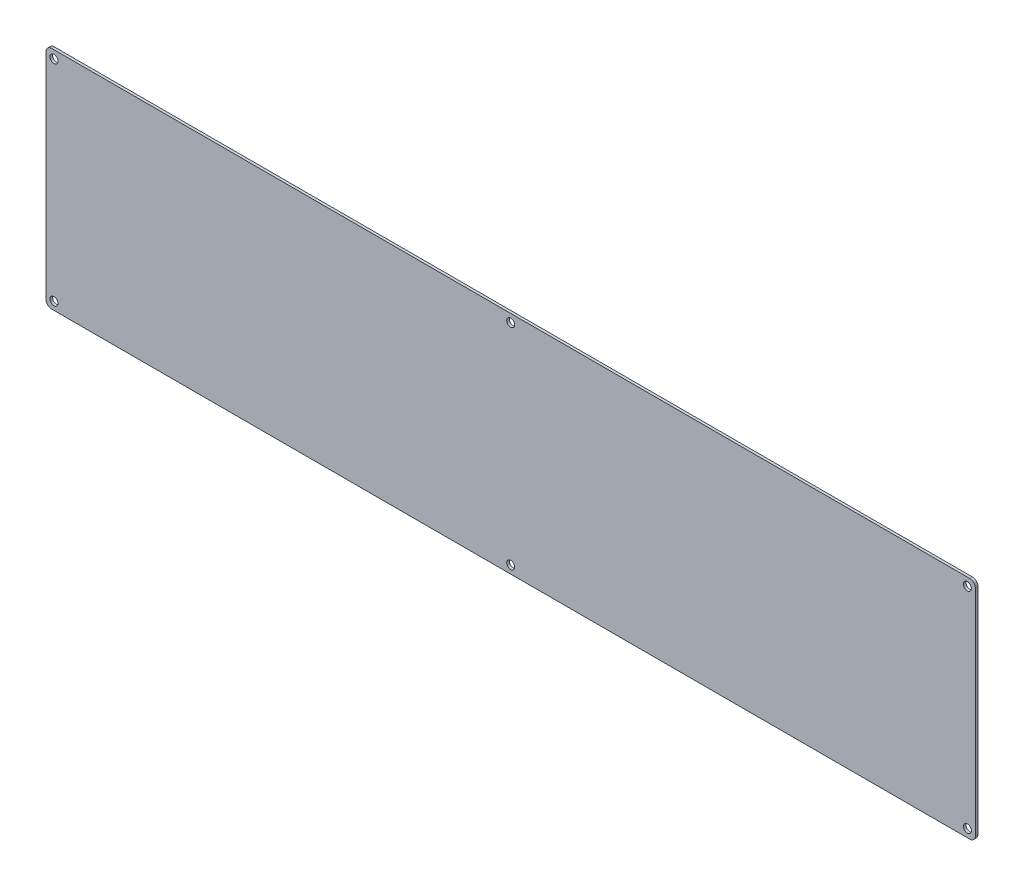
ISO-10303-21;
HEADER;
FILE_DESCRIPTION(('STEP AP214'),'2;1');
FILE_NAME('part.step','',(''),(''),'','','');
FILE_SCHEMA(('AUTOMOTIVE_DESIGN { 1 0 10303 214 1 1 1 1 }'));
ENDSEC;
DATA;
#1=APPLICATION_CONTEXT('core data for automotive mechanical design processes');
#2=APPLICATION_PROTOCOL_DEFINITION('international standard','automotive_design',2000,#1);
#3=PRODUCT_CONTEXT('',#1,'mechanical');
#4=PRODUCT('Part','Part','',(#3));
#5=PRODUCT_RELATED_PRODUCT_CATEGORY('part','',(#4));
#6=PRODUCT_DEFINITION_FORMATION('','',#4);
#7=PRODUCT_DEFINITION_CONTEXT('part definition',#1,'design');
#8=PRODUCT_DEFINITION('design','',#6,#7);
#9=PRODUCT_DEFINITION_SHAPE('','',#8);
#10=(LENGTH_UNIT() NAMED_UNIT(*) SI_UNIT(.MILLI.,.METRE.));
#11=(NAMED_UNIT(*) PLANE_ANGLE_UNIT() SI_UNIT($,.RADIAN.));
#12=(NAMED_UNIT(*) SI_UNIT($,.STERADIAN.) SOLID_ANGLE_UNIT());
#13=UNCERTAINTY_MEASURE_WITH_UNIT(LENGTH_MEASURE(1.E-05),#10,'distance_accuracy_value','');
#14=(GEOMETRIC_REPRESENTATION_CONTEXT(3) GLOBAL_UNCERTAINTY_ASSIGNED_CONTEXT((#13)) GLOBAL_UNIT_ASSIGNED_CONTEXT((#10,
#11,#12)) REPRESENTATION_CONTEXT('',''));
#15=CARTESIAN_POINT('',(0.,0.,0.));
#16=DIRECTION('',(0.,0.,1.));
#17=DIRECTION('',(1.,0.,0.));
#18=AXIS2_PLACEMENT_3D('',#15,#16,#17);
#19=CARTESIAN_POINT('',(5.,193.,2.3));
#20=DIRECTION('',(0.,0.,-1.));
#21=DIRECTION('',(-1.,0.,0.));
#22=AXIS2_PLACEMENT_3D('',#19,#20,#21);
#23=CYLINDRICAL_SURFACE('',#22,5.);
#24=CARTESIAN_POINT('',(5.,193.,0.));
#25=DIRECTION('',(0.,0.,1.));
#26=DIRECTION('',(-1.,0.,0.));
#27=AXIS2_PLACEMENT_3D('',#24,#25,#26);
#28=CIRCLE('',#27,5.);
#29=CARTESIAN_POINT('',(5.00000000000004,198.,0.));
#30=VERTEX_POINT('',#29);
#31=CARTESIAN_POINT('',(0.,193.,0.));
#32=VERTEX_POINT('',#31);
#33=EDGE_CURVE('E137',#30,#32,#28,.T.);
#34=ORIENTED_EDGE('',*,*,#33,.T.);
#35=DIRECTION('',(0.,0.,-1.));
#36=VECTOR('',#35,1.);
#37=CARTESIAN_POINT('',(0.,193.,2.3));
#38=LINE('',#37,#36);
#39=CARTESIAN_POINT('',(0.,193.,2.3));
#40=VERTEX_POINT('',#39);
#41=EDGE_CURVE('E11',#40,#32,#38,.T.);
#42=ORIENTED_EDGE('',*,*,#41,.F.);
#43=CARTESIAN_POINT('',(5.,193.,2.3));
#44=DIRECTION('',(0.,0.,1.));
#45=DIRECTION('',(-1.,0.,0.));
#46=AXIS2_PLACEMENT_3D('',#43,#44,#45);
#47=CIRCLE('',#46,5.);
#48=CARTESIAN_POINT('',(5.00000000000004,198.,2.3));
#49=VERTEX_POINT('',#48);
#50=EDGE_CURVE('E151',#49,#40,#47,.T.);
#51=ORIENTED_EDGE('',*,*,#50,.F.);
#52=DIRECTION('',(0.,0.,-1.));
#53=VECTOR('',#52,1.);
#54=CARTESIAN_POINT('',(5.00000000000004,198.,2.3));
#55=LINE('',#54,#53);
#56=EDGE_CURVE('E133',#49,#30,#55,.T.);
#57=ORIENTED_EDGE('',*,*,#56,.T.);
#58=EDGE_LOOP('',(#34,#42,#51,#57));
#59=FACE_BOUND('',#58,.T.);
#60=ADVANCED_FACE('F39',(#59),#23,.T.);
#61=CARTESIAN_POINT('',(0.,5.00000000000004,2.3));
#62=DIRECTION('',(1.,0.,0.));
#63=DIRECTION('',(0.,0.,-1.));
#64=AXIS2_PLACEMENT_3D('',#61,#62,#63);
#65=PLANE('',#64);
#66=DIRECTION('',(0.,-1.,0.));
#67=VECTOR('',#66,1.);
#68=CARTESIAN_POINT('',(0.,5.00000000000004,0.));
#69=LINE('',#68,#67);
#70=CARTESIAN_POINT('',(0.,5.00000000000004,0.));
#71=VERTEX_POINT('',#70);
#72=EDGE_CURVE('E140',#32,#71,#69,.T.);
#73=ORIENTED_EDGE('',*,*,#72,.T.);
#74=DIRECTION('',(0.,0.,-1.));
#75=VECTOR('',#74,1.);
#76=CARTESIAN_POINT('',(0.,5.00000000000004,2.3));
#77=LINE('',#76,#75);
#78=CARTESIAN_POINT('',(0.,5.00000000000004,2.3));
#79=VERTEX_POINT('',#78);
#80=EDGE_CURVE('E48',#79,#71,#77,.T.);
#81=ORIENTED_EDGE('',*,*,#80,.F.);
#82=DIRECTION('',(0.,-1.,0.));
#83=VECTOR('',#82,1.);
#84=CARTESIAN_POINT('',(0.,5.00000000000004,2.3));
#85=LINE('',#84,#83);
#86=EDGE_CURVE('E100',#40,#79,#85,.T.);
#87=ORIENTED_EDGE('',*,*,#86,.F.);
#88=ORIENTED_EDGE('',*,*,#41,.T.);
#89=EDGE_LOOP('',(#73,#81,#87,#88));
#90=FACE_BOUND('',#89,.T.);
#91=ADVANCED_FACE('F215',(#90),#65,.F.);
#92=CARTESIAN_POINT('',(5.,5.,2.3));
#93=DIRECTION('',(0.,0.,-1.));
#94=DIRECTION('',(-1.,0.,0.));
#95=AXIS2_PLACEMENT_3D('',#92,#93,#94);
#96=CYLINDRICAL_SURFACE('',#95,5.);
#97=CARTESIAN_POINT('',(5.,5.,0.));
#98=DIRECTION('',(0.,0.,1.));
#99=DIRECTION('',(-1.,0.,0.));
#100=AXIS2_PLACEMENT_3D('',#97,#98,#99);
#101=CIRCLE('',#100,5.);
#102=CARTESIAN_POINT('',(5.00000000000004,0.,0.));
#103=VERTEX_POINT('',#102);
#104=EDGE_CURVE('E142',#71,#103,#101,.T.);
#105=ORIENTED_EDGE('',*,*,#104,.T.);
#106=DIRECTION('',(0.,0.,-1.));
#107=VECTOR('',#106,1.);
#108=CARTESIAN_POINT('',(5.00000000000004,0.,2.3));
#109=LINE('',#108,#107);
#110=CARTESIAN_POINT('',(5.00000000000004,0.,2.3));
#111=VERTEX_POINT('',#110);
#112=EDGE_CURVE('E158',#111,#103,#109,.T.);
#113=ORIENTED_EDGE('',*,*,#112,.F.);
#114=CARTESIAN_POINT('',(5.,5.,2.3));
#115=DIRECTION('',(0.,0.,1.));
#116=DIRECTION('',(-1.,0.,0.));
#117=AXIS2_PLACEMENT_3D('',#114,#115,#116);
#118=CIRCLE('',#117,5.);
#119=EDGE_CURVE('E399',#79,#111,#118,.T.);
#120=ORIENTED_EDGE('',*,*,#119,.F.);
#121=ORIENTED_EDGE('',*,*,#80,.T.);
#122=EDGE_LOOP('',(#105,#113,#120,#121));
#123=FACE_BOUND('',#122,.T.);
#124=ADVANCED_FACE('F219',(#123),#96,.T.);
#125=CARTESIAN_POINT('',(5.00000000000004,0.,2.3));
#126=DIRECTION('',(0.,1.,0.));
#127=DIRECTION('',(0.,0.,1.));
#128=AXIS2_PLACEMENT_3D('',#125,#126,#127);
#129=PLANE('',#128);
#130=DIRECTION('',(1.,0.,0.));
#131=VECTOR('',#130,1.);
#132=CARTESIAN_POINT('',(5.00000000000004,0.,0.));
#133=LINE('',#132,#131);
#134=CARTESIAN_POINT('',(810.,0.,0.));
#135=VERTEX_POINT('',#134);
#136=EDGE_CURVE('E144',#103,#135,#133,.T.);
#137=ORIENTED_EDGE('',*,*,#136,.T.);
#138=DIRECTION('',(0.,0.,-1.));
#139=VECTOR('',#138,1.);
#140=CARTESIAN_POINT('',(810.,0.,2.3));
#141=LINE('',#140,#139);
#142=CARTESIAN_POINT('',(810.,0.,2.3));
#143=VERTEX_POINT('',#142);
#144=EDGE_CURVE('E155',#143,#135,#141,.T.);
#145=ORIENTED_EDGE('',*,*,#144,.F.);
#146=DIRECTION('',(1.,0.,0.));
#147=VECTOR('',#146,1.);
#148=CARTESIAN_POINT('',(5.00000000000004,0.,2.3));
#149=LINE('',#148,#147);
#150=EDGE_CURVE('E401',#111,#143,#149,.T.);
#151=ORIENTED_EDGE('',*,*,#150,.F.);
#152=ORIENTED_EDGE('',*,*,#112,.T.);
#153=EDGE_LOOP('',(#137,#145,#151,#152));
#154=FACE_BOUND('',#153,.T.);
#155=ADVANCED_FACE('F223',(#154),#129,.F.);
#156=CARTESIAN_POINT('',(810.,5.,2.3));
#157=DIRECTION('',(0.,0.,-1.));
#158=DIRECTION('',(-1.,0.,0.));
#159=AXIS2_PLACEMENT_3D('',#156,#157,#158);
#160=CYLINDRICAL_SURFACE('',#159,5.);
#161=CARTESIAN_POINT('',(810.,5.,0.));
#162=DIRECTION('',(0.,0.,1.));
#163=DIRECTION('',(1.,0.,0.));
#164=AXIS2_PLACEMENT_3D('',#161,#162,#163);
#165=CIRCLE('',#164,5.);
#166=CARTESIAN_POINT('',(815.,5.,0.));
#167=VERTEX_POINT('',#166);
#168=EDGE_CURVE('E146',#135,#167,#165,.T.);
#169=ORIENTED_EDGE('',*,*,#168,.T.);
#170=DIRECTION('',(0.,0.,-1.));
#171=VECTOR('',#170,1.);
#172=CARTESIAN_POINT('',(815.,5.,2.3));
#173=LINE('',#172,#171);
#174=CARTESIAN_POINT('',(815.,5.,2.3));
#175=VERTEX_POINT('',#174);
#176=EDGE_CURVE('E128',#175,#167,#173,.T.);
#177=ORIENTED_EDGE('',*,*,#176,.F.);
#178=CARTESIAN_POINT('',(810.,5.,2.3));
#179=DIRECTION('',(0.,0.,1.));
#180=DIRECTION('',(1.,0.,0.));
#181=AXIS2_PLACEMENT_3D('',#178,#179,#180);
#182=CIRCLE('',#181,5.);
#183=EDGE_CURVE('E119',#143,#175,#182,.T.);
#184=ORIENTED_EDGE('',*,*,#183,.F.);
#185=ORIENTED_EDGE('',*,*,#144,.T.);
#186=EDGE_LOOP('',(#169,#177,#184,#185));
#187=FACE_BOUND('',#186,.T.);
#188=ADVANCED_FACE('F229',(#187),#160,.T.);
#189=CARTESIAN_POINT('',(815.,5.00000000000004,2.3));
#190=DIRECTION('',(-1.,0.,0.));
#191=DIRECTION('',(0.,0.,1.));
#192=AXIS2_PLACEMENT_3D('',#189,#190,#191);
#193=PLANE('',#192);
#194=DIRECTION('',(0.,1.,0.));
#195=VECTOR('',#194,1.);
#196=CARTESIAN_POINT('',(815.,5.00000000000004,0.));
#197=LINE('',#196,#195);
#198=CARTESIAN_POINT('',(815.,193.,0.));
#199=VERTEX_POINT('',#198);
#200=EDGE_CURVE('E127',#167,#199,#197,.T.);
#201=ORIENTED_EDGE('',*,*,#200,.T.);
#202=DIRECTION('',(0.,0.,-1.));
#203=VECTOR('',#202,1.);
#204=CARTESIAN_POINT('',(815.,193.,2.3));
#205=LINE('',#204,#203);
#206=CARTESIAN_POINT('',(815.,193.,2.3));
#207=VERTEX_POINT('',#206);
#208=EDGE_CURVE('E124',#207,#199,#205,.T.);
#209=ORIENTED_EDGE('',*,*,#208,.F.);
#210=DIRECTION('',(0.,1.,0.));
#211=VECTOR('',#210,1.);
#212=CARTESIAN_POINT('',(815.,5.00000000000004,2.3));
#213=LINE('',#212,#211);
#214=EDGE_CURVE('E113',#175,#207,#213,.T.);
#215=ORIENTED_EDGE('',*,*,#214,.F.);
#216=ORIENTED_EDGE('',*,*,#176,.T.);
#217=EDGE_LOOP('',(#201,#209,#215,#216));
#218=FACE_BOUND('',#217,.T.);
#219=ADVANCED_FACE('F125',(#218),#193,.F.);
#220=CARTESIAN_POINT('',(810.,193.,2.3));
#221=DIRECTION('',(0.,0.,-1.));
#222=DIRECTION('',(-1.,0.,0.));
#223=AXIS2_PLACEMENT_3D('',#220,#221,#222);
#224=CYLINDRICAL_SURFACE('',#223,5.);
#225=CARTESIAN_POINT('',(810.,193.,0.));
#226=DIRECTION('',(0.,0.,1.));
#227=DIRECTION('',(-1.,0.,0.));
#228=AXIS2_PLACEMENT_3D('',#225,#226,#227);
#229=CIRCLE('',#228,5.);
#230=CARTESIAN_POINT('',(810.,198.,0.));
#231=VERTEX_POINT('',#230);
#232=EDGE_CURVE('E86',#199,#231,#229,.T.);
#233=ORIENTED_EDGE('',*,*,#232,.T.);
#234=DIRECTION('',(0.,0.,-1.));
#235=VECTOR('',#234,1.);
#236=CARTESIAN_POINT('',(810.,198.,2.3));
#237=LINE('',#236,#235);
#238=CARTESIAN_POINT('',(810.,198.,2.3));
#239=VERTEX_POINT('',#238);
#240=EDGE_CURVE('E129',#239,#231,#237,.T.);
#241=ORIENTED_EDGE('',*,*,#240,.F.);
#242=CARTESIAN_POINT('',(810.,193.,2.3));
#243=DIRECTION('',(0.,0.,1.));
#244=DIRECTION('',(-1.,0.,0.));
#245=AXIS2_PLACEMENT_3D('',#242,#243,#244);
#246=CIRCLE('',#245,5.);
#247=EDGE_CURVE('E117',#207,#239,#246,.T.);
#248=ORIENTED_EDGE('',*,*,#247,.F.);
#249=ORIENTED_EDGE('',*,*,#208,.T.);
#250=EDGE_LOOP('',(#233,#241,#248,#249));
#251=FACE_BOUND('',#250,.T.);
#252=ADVANCED_FACE('F131',(#251),#224,.T.);
#253=CARTESIAN_POINT('',(5.00000000000004,198.,2.3));
#254=DIRECTION('',(0.,-1.,0.));
#255=DIRECTION('',(0.,0.,-1.));
#256=AXIS2_PLACEMENT_3D('',#253,#254,#255);
#257=PLANE('',#256);
#258=DIRECTION('',(-1.,0.,0.));
#259=VECTOR('',#258,1.);
#260=CARTESIAN_POINT('',(5.00000000000004,198.,0.));
#261=LINE('',#260,#259);
#262=EDGE_CURVE('E92',#231,#30,#261,.T.);
#263=ORIENTED_EDGE('',*,*,#262,.T.);
#264=ORIENTED_EDGE('',*,*,#56,.F.);
#265=DIRECTION('',(-1.,0.,0.));
#266=VECTOR('',#265,1.);
#267=CARTESIAN_POINT('',(5.00000000000004,198.,2.3));
#268=LINE('',#267,#266);
#269=EDGE_CURVE('E57',#239,#49,#268,.T.);
#270=ORIENTED_EDGE('',*,*,#269,.F.);
#271=ORIENTED_EDGE('',*,*,#240,.T.);
#272=EDGE_LOOP('',(#263,#264,#270,#271));
#273=FACE_BOUND('',#272,.T.);
#274=ADVANCED_FACE('F204',(#273),#257,.F.);
#275=CARTESIAN_POINT('',(5.,193.,2.3));
#276=DIRECTION('',(0.,0.,-1.));
#277=DIRECTION('',(-1.,0.,0.));
#278=AXIS2_PLACEMENT_3D('',#275,#276,#277);
#279=PLANE('',#278);
#280=CARTESIAN_POINT('',(808.,7.,2.3));
#281=DIRECTION('',(0.,0.,1.));
#282=DIRECTION('',(1.,0.,0.));
#283=AXIS2_PLACEMENT_3D('',#280,#281,#282);
#284=CIRCLE('',#283,3.49999999999995);
#285=CARTESIAN_POINT('',(811.5,7.,2.3));
#286=VERTEX_POINT('',#285);
#287=EDGE_CURVE('E383',#286,#286,#284,.T.);
#288=ORIENTED_EDGE('',*,*,#287,.F.);
#289=EDGE_LOOP('',(#288));
#290=FACE_BOUND('',#289,.T.);
#291=CARTESIAN_POINT('',(407.5,191.,2.3));
#292=DIRECTION('',(0.,0.,1.));
#293=DIRECTION('',(1.,0.,0.));
#294=AXIS2_PLACEMENT_3D('',#291,#292,#293);
#295=CIRCLE('',#294,3.5);
#296=CARTESIAN_POINT('',(411.,191.,2.3));
#297=VERTEX_POINT('',#296);
#298=EDGE_CURVE('E380',#297,#297,#295,.T.);
#299=ORIENTED_EDGE('',*,*,#298,.F.);
#300=EDGE_LOOP('',(#299));
#301=FACE_BOUND('',#300,.T.);
#302=CARTESIAN_POINT('',(407.5,7.,2.3));
#303=DIRECTION('',(0.,0.,1.));
#304=DIRECTION('',(1.,0.,0.));
#305=AXIS2_PLACEMENT_3D('',#302,#303,#304);
#306=CIRCLE('',#305,3.5);
#307=CARTESIAN_POINT('',(411.,7.,2.3));
#308=VERTEX_POINT('',#307);
#309=EDGE_CURVE('E382',#308,#308,#306,.T.);
#310=ORIENTED_EDGE('',*,*,#309,.F.);
#311=EDGE_LOOP('',(#310));
#312=FACE_BOUND('',#311,.T.);
#313=CARTESIAN_POINT('',(7.,191.,2.3));
#314=DIRECTION('',(0.,0.,1.));
#315=DIRECTION('',(1.,0.,0.));
#316=AXIS2_PLACEMENT_3D('',#313,#314,#315);
#317=CIRCLE('',#316,3.5);
#318=CARTESIAN_POINT('',(10.5,191.,2.3));
#319=VERTEX_POINT('',#318);
#320=EDGE_CURVE('E386',#319,#319,#317,.T.);
#321=ORIENTED_EDGE('',*,*,#320,.F.);
#322=EDGE_LOOP('',(#321));
#323=FACE_BOUND('',#322,.T.);
#324=CARTESIAN_POINT('',(808.,191.,2.3));
#325=DIRECTION('',(0.,0.,1.));
#326=DIRECTION('',(1.,0.,0.));
#327=AXIS2_PLACEMENT_3D('',#324,#325,#326);
#328=CIRCLE('',#327,3.49999999999995);
#329=CARTESIAN_POINT('',(811.5,191.,2.3));
#330=VERTEX_POINT('',#329);
#331=EDGE_CURVE('E389',#330,#330,#328,.T.);
#332=ORIENTED_EDGE('',*,*,#331,.F.);
#333=EDGE_LOOP('',(#332));
#334=FACE_BOUND('',#333,.T.);
#335=CARTESIAN_POINT('',(7.,7.,2.3));
#336=DIRECTION('',(0.,0.,1.));
#337=DIRECTION('',(1.,0.,0.));
#338=AXIS2_PLACEMENT_3D('',#335,#336,#337);
#339=CIRCLE('',#338,3.5);
#340=CARTESIAN_POINT('',(10.5,7.,2.3));
#341=VERTEX_POINT('',#340);
#342=EDGE_CURVE('E167',#341,#341,#339,.T.);
#343=ORIENTED_EDGE('',*,*,#342,.F.);
#344=EDGE_LOOP('',(#343));
#345=FACE_BOUND('',#344,.T.);
#346=ORIENTED_EDGE('',*,*,#50,.T.);
#347=ORIENTED_EDGE('',*,*,#86,.T.);
#348=ORIENTED_EDGE('',*,*,#119,.T.);
#349=ORIENTED_EDGE('',*,*,#150,.T.);
#350=ORIENTED_EDGE('',*,*,#183,.T.);
#351=ORIENTED_EDGE('',*,*,#214,.T.);
#352=ORIENTED_EDGE('',*,*,#247,.T.);
#353=ORIENTED_EDGE('',*,*,#269,.T.);
#354=EDGE_LOOP('',(#346,#347,#348,#349,#350,#351,#352,#353));
#355=FACE_BOUND('',#354,.T.);
#356=ADVANCED_FACE('F115',(#290,#301,#312,#323,#334,#345,#355),#279,.F.);
#357=CARTESIAN_POINT('',(5.,193.,0.));
#358=DIRECTION('',(0.,0.,-1.));
#359=DIRECTION('',(-1.,0.,0.));
#360=AXIS2_PLACEMENT_3D('',#357,#358,#359);
#361=PLANE('',#360);
#362=CARTESIAN_POINT('',(808.,7.,0.));
#363=DIRECTION('',(0.,0.,-1.));
#364=DIRECTION('',(-1.,0.,0.));
#365=AXIS2_PLACEMENT_3D('',#362,#363,#364);
#366=CIRCLE('',#365,3.49999999999995);
#367=CARTESIAN_POINT('',(811.5,7.,0.));
#368=VERTEX_POINT('',#367);
#369=EDGE_CURVE('E42',#368,#368,#366,.T.);
#370=ORIENTED_EDGE('',*,*,#369,.F.);
#371=EDGE_LOOP('',(#370));
#372=FACE_BOUND('',#371,.T.);
#373=CARTESIAN_POINT('',(407.5,191.,0.));
#374=DIRECTION('',(0.,0.,-1.));
#375=DIRECTION('',(-1.,0.,0.));
#376=AXIS2_PLACEMENT_3D('',#373,#374,#375);
#377=CIRCLE('',#376,3.5);
#378=CARTESIAN_POINT('',(411.,191.,0.));
#379=VERTEX_POINT('',#378);
#380=EDGE_CURVE('E175',#379,#379,#377,.T.);
#381=ORIENTED_EDGE('',*,*,#380,.F.);
#382=EDGE_LOOP('',(#381));
#383=FACE_BOUND('',#382,.T.);
#384=CARTESIAN_POINT('',(407.5,7.,0.));
#385=DIRECTION('',(0.,0.,-1.));
#386=DIRECTION('',(-1.,0.,0.));
#387=AXIS2_PLACEMENT_3D('',#384,#385,#386);
#388=CIRCLE('',#387,3.5);
#389=CARTESIAN_POINT('',(411.,7.,0.));
#390=VERTEX_POINT('',#389);
#391=EDGE_CURVE('E173',#390,#390,#388,.T.);
#392=ORIENTED_EDGE('',*,*,#391,.F.);
#393=EDGE_LOOP('',(#392));
#394=FACE_BOUND('',#393,.T.);
#395=CARTESIAN_POINT('',(7.,191.,0.));
#396=DIRECTION('',(0.,0.,-1.));
#397=DIRECTION('',(-1.,0.,0.));
#398=AXIS2_PLACEMENT_3D('',#395,#396,#397);
#399=CIRCLE('',#398,3.5);
#400=CARTESIAN_POINT('',(10.5,191.,0.));
#401=VERTEX_POINT('',#400);
#402=EDGE_CURVE('E170',#401,#401,#399,.T.);
#403=ORIENTED_EDGE('',*,*,#402,.F.);
#404=EDGE_LOOP('',(#403));
#405=FACE_BOUND('',#404,.T.);
#406=CARTESIAN_POINT('',(808.,191.,0.));
#407=DIRECTION('',(0.,0.,-1.));
#408=DIRECTION('',(-1.,0.,0.));
#409=AXIS2_PLACEMENT_3D('',#406,#407,#408);
#410=CIRCLE('',#409,3.49999999999995);
#411=CARTESIAN_POINT('',(811.5,191.,0.));
#412=VERTEX_POINT('',#411);
#413=EDGE_CURVE('E166',#412,#412,#410,.T.);
#414=ORIENTED_EDGE('',*,*,#413,.F.);
#415=EDGE_LOOP('',(#414));
#416=FACE_BOUND('',#415,.T.);
#417=CARTESIAN_POINT('',(7.,7.,0.));
#418=DIRECTION('',(0.,0.,-1.));
#419=DIRECTION('',(-1.,0.,0.));
#420=AXIS2_PLACEMENT_3D('',#417,#418,#419);
#421=CIRCLE('',#420,3.5);
#422=CARTESIAN_POINT('',(10.5,7.,0.));
#423=VERTEX_POINT('',#422);
#424=EDGE_CURVE('E163',#423,#423,#421,.T.);
#425=ORIENTED_EDGE('',*,*,#424,.F.);
#426=EDGE_LOOP('',(#425));
#427=FACE_BOUND('',#426,.T.);
#428=ORIENTED_EDGE('',*,*,#33,.F.);
#429=ORIENTED_EDGE('',*,*,#262,.F.);
#430=ORIENTED_EDGE('',*,*,#232,.F.);
#431=ORIENTED_EDGE('',*,*,#200,.F.);
#432=ORIENTED_EDGE('',*,*,#168,.F.);
#433=ORIENTED_EDGE('',*,*,#136,.F.);
#434=ORIENTED_EDGE('',*,*,#104,.F.);
#435=ORIENTED_EDGE('',*,*,#72,.F.);
#436=EDGE_LOOP('',(#428,#429,#430,#431,#432,#433,#434,#435));
#437=FACE_BOUND('',#436,.T.);
#438=ADVANCED_FACE('F185',(#372,#383,#394,#405,#416,#427,#437),#361,.T.);
#439=CARTESIAN_POINT('',(7.,7.,-1.2E-05));
#440=DIRECTION('',(0.,0.,1.));
#441=DIRECTION('',(1.,0.,0.));
#442=AXIS2_PLACEMENT_3D('',#439,#440,#441);
#443=CYLINDRICAL_SURFACE('',#442,3.5);
#444=CARTESIAN_POINT('',(10.5,7.,0.));
#445=CARTESIAN_POINT('',(10.5,7.,0.0239583333333333));
#446=CARTESIAN_POINT('',(10.5,7.,0.0479166666666667));
#447=CARTESIAN_POINT('',(10.5,7.,0.0958333333333333));
#448=CARTESIAN_POINT('',(10.5,7.,0.119791666666667));
#449=CARTESIAN_POINT('',(10.5,7.,0.167708333333333));
#450=CARTESIAN_POINT('',(10.5,7.,0.191666666666667));
#451=CARTESIAN_POINT('',(10.5,7.,0.239583333333333));
#452=CARTESIAN_POINT('',(10.5,7.,0.263541666666667));
#453=CARTESIAN_POINT('',(10.5,7.,0.311458333333333));
#454=CARTESIAN_POINT('',(10.5,7.,0.335416666666667));
#455=CARTESIAN_POINT('',(10.5,7.,0.383333333333333));
#456=CARTESIAN_POINT('',(10.5,7.,0.407291666666667));
#457=CARTESIAN_POINT('',(10.5,7.,0.455208333333333));
#458=CARTESIAN_POINT('',(10.5,7.,0.479166666666667));
#459=CARTESIAN_POINT('',(10.5,7.,0.527083333333333));
#460=CARTESIAN_POINT('',(10.5,7.,0.551041666666667));
#461=CARTESIAN_POINT('',(10.5,7.,0.598958333333333));
#462=CARTESIAN_POINT('',(10.5,7.,0.622916666666667));
#463=CARTESIAN_POINT('',(10.5,7.,0.670833333333333));
#464=CARTESIAN_POINT('',(10.5,7.,0.694791666666667));
#465=CARTESIAN_POINT('',(10.5,7.,0.742708333333333));
#466=CARTESIAN_POINT('',(10.5,7.,0.766666666666667));
#467=CARTESIAN_POINT('',(10.5,7.,0.814583333333333));
#468=CARTESIAN_POINT('',(10.5,7.,0.838541666666667));
#469=CARTESIAN_POINT('',(10.5,7.,0.886458333333333));
#470=CARTESIAN_POINT('',(10.5,7.,0.910416666666667));
#471=CARTESIAN_POINT('',(10.5,7.,0.958333333333333));
#472=CARTESIAN_POINT('',(10.5,7.,0.982291666666667));
#473=CARTESIAN_POINT('',(10.5,7.,1.03020833333333));
#474=CARTESIAN_POINT('',(10.5,7.,1.05416666666667));
#475=CARTESIAN_POINT('',(10.5,7.,1.10208333333333));
#476=CARTESIAN_POINT('',(10.5,7.,1.12604166666667));
#477=CARTESIAN_POINT('',(10.5,7.,1.17395833333333));
#478=CARTESIAN_POINT('',(10.5,7.,1.19791666666667));
#479=CARTESIAN_POINT('',(10.5,7.,1.24583333333333));
#480=CARTESIAN_POINT('',(10.5,7.,1.26979166666667));
#481=CARTESIAN_POINT('',(10.5,7.,1.31770833333333));
#482=CARTESIAN_POINT('',(10.5,7.,1.34166666666667));
#483=CARTESIAN_POINT('',(10.5,7.,1.38958333333333));
#484=CARTESIAN_POINT('',(10.5,7.,1.41354166666667));
#485=CARTESIAN_POINT('',(10.5,7.,1.46145833333333));
#486=CARTESIAN_POINT('',(10.5,7.,1.48541666666667));
#487=CARTESIAN_POINT('',(10.5,7.,1.53333333333333));
#488=CARTESIAN_POINT('',(10.5,7.,1.55729166666667));
#489=CARTESIAN_POINT('',(10.5,7.,1.60520833333333));
#490=CARTESIAN_POINT('',(10.5,7.,1.62916666666667));
#491=CARTESIAN_POINT('',(10.5,7.,1.67708333333333));
#492=CARTESIAN_POINT('',(10.5,7.,1.70104166666667));
#493=CARTESIAN_POINT('',(10.5,7.,1.74895833333333));
#494=CARTESIAN_POINT('',(10.5,7.,1.77291666666667));
#495=CARTESIAN_POINT('',(10.5,7.,1.82083333333333));
#496=CARTESIAN_POINT('',(10.5,7.,1.84479166666667));
#497=CARTESIAN_POINT('',(10.5,7.,1.89270833333333));
#498=CARTESIAN_POINT('',(10.5,7.,1.91666666666667));
#499=CARTESIAN_POINT('',(10.5,7.,1.96458333333333));
#500=CARTESIAN_POINT('',(10.5,7.,1.98854166666667));
#501=CARTESIAN_POINT('',(10.5,7.,2.03645833333333));
#502=CARTESIAN_POINT('',(10.5,7.,2.06041666666667));
#503=CARTESIAN_POINT('',(10.5,7.,2.10833333333333));
#504=CARTESIAN_POINT('',(10.5,7.,2.13229166666667));
#505=CARTESIAN_POINT('',(10.5,7.,2.18020833333333));
#506=CARTESIAN_POINT('',(10.5,7.,2.20416666666667));
#507=CARTESIAN_POINT('',(10.5,7.,2.25208333333333));
#508=CARTESIAN_POINT('',(10.5,7.,2.27604166666667));
#509=CARTESIAN_POINT('',(10.5,7.,2.3));
#510=B_SPLINE_CURVE_WITH_KNOTS('',3,(#444,#445,#446,#447,#448,#449,#450,#451,#452,#453,#454,
#455,#456,#457,#458,#459,#460,#461,#462,#463,#464,#465,#466,#467,#468,#469,#470,#471,#472,#473,
#474,#475,#476,#477,#478,#479,#480,#481,#482,#483,#484,#485,#486,#487,#488,#489,#490,#491,#492,
#493,#494,#495,#496,#497,#498,#499,#500,#501,#502,#503,#504,#505,#506,#507,#508,#509),
.UNSPECIFIED.,.F.,.F.,(4,2,2,2,2,2,2,2,2,2,2,2,2,2,2,2,2,2,2,2,2,2,2,2,2,2,2,2,2,2,2,2,4),(0.,
0.071875,0.14375,0.215625,0.2875,0.359375,0.43125,0.503125,0.575,0.646875,0.71875,0.790625,
0.8625,0.934375,1.00625,1.078125,1.15,1.221875,1.29375,1.365625,1.4375,1.509375,1.58125,
1.653125,1.725,1.796875,1.86875,1.940625,2.0125,2.084375,2.15625,2.228125,2.3),.UNSPECIFIED.);
#511=EDGE_CURVE('BSEAM188',#423,#341,#510,.T.);
#512=ORIENTED_EDGE('',*,*,#424,.T.);
#513=ORIENTED_EDGE('',*,*,#342,.T.);
#514=ORIENTED_EDGE('',*,*,#511,.T.);
#515=ORIENTED_EDGE('',*,*,#511,.F.);
#516=EDGE_LOOP('',(#512,#514,#513,#515));
#517=FACE_BOUND('',#516,.T.);
#518=ADVANCED_FACE('F188',(#517),#443,.F.);
#519=CARTESIAN_POINT('',(808.,191.,-1.2E-05));
#520=DIRECTION('',(0.,0.,1.));
#521=DIRECTION('',(1.,0.,0.));
#522=AXIS2_PLACEMENT_3D('',#519,#520,#521);
#523=CYLINDRICAL_SURFACE('',#522,3.49999999999995);
#524=CARTESIAN_POINT('',(811.5,191.,0.));
#525=CARTESIAN_POINT('',(811.5,191.,0.0239583333333333));
#526=CARTESIAN_POINT('',(811.5,191.,0.0479166666666667));
#527=CARTESIAN_POINT('',(811.5,191.,0.0958333333333333));
#528=CARTESIAN_POINT('',(811.5,191.,0.119791666666667));
#529=CARTESIAN_POINT('',(811.5,191.,0.167708333333333));
#530=CARTESIAN_POINT('',(811.5,191.,0.191666666666667));
#531=CARTESIAN_POINT('',(811.5,191.,0.239583333333333));
#532=CARTESIAN_POINT('',(811.5,191.,0.263541666666667));
#533=CARTESIAN_POINT('',(811.5,191.,0.311458333333333));
#534=CARTESIAN_POINT('',(811.5,191.,0.335416666666667));
#535=CARTESIAN_POINT('',(811.5,191.,0.383333333333333));
#536=CARTESIAN_POINT('',(811.5,191.,0.407291666666667));
#537=CARTESIAN_POINT('',(811.5,191.,0.455208333333333));
#538=CARTESIAN_POINT('',(811.5,191.,0.479166666666667));
#539=CARTESIAN_POINT('',(811.5,191.,0.527083333333333));
#540=CARTESIAN_POINT('',(811.5,191.,0.551041666666667));
#541=CARTESIAN_POINT('',(811.5,191.,0.598958333333333));
#542=CARTESIAN_POINT('',(811.5,191.,0.622916666666667));
#543=CARTESIAN_POINT('',(811.5,191.,0.670833333333333));
#544=CARTESIAN_POINT('',(811.5,191.,0.694791666666667));
#545=CARTESIAN_POINT('',(811.5,191.,0.742708333333333));
#546=CARTESIAN_POINT('',(811.5,191.,0.766666666666667));
#547=CARTESIAN_POINT('',(811.5,191.,0.814583333333333));
#548=CARTESIAN_POINT('',(811.5,191.,0.838541666666667));
#549=CARTESIAN_POINT('',(811.5,191.,0.886458333333333));
#550=CARTESIAN_POINT('',(811.5,191.,0.910416666666667));
#551=CARTESIAN_POINT('',(811.5,191.,0.958333333333333));
#552=CARTESIAN_POINT('',(811.5,191.,0.982291666666667));
#553=CARTESIAN_POINT('',(811.5,191.,1.03020833333333));
#554=CARTESIAN_POINT('',(811.5,191.,1.05416666666667));
#555=CARTESIAN_POINT('',(811.5,191.,1.10208333333333));
#556=CARTESIAN_POINT('',(811.5,191.,1.12604166666667));
#557=CARTESIAN_POINT('',(811.5,191.,1.17395833333333));
#558=CARTESIAN_POINT('',(811.5,191.,1.19791666666667));
#559=CARTESIAN_POINT('',(811.5,191.,1.24583333333333));
#560=CARTESIAN_POINT('',(811.5,191.,1.26979166666667));
#561=CARTESIAN_POINT('',(811.5,191.,1.31770833333333));
#562=CARTESIAN_POINT('',(811.5,191.,1.34166666666667));
#563=CARTESIAN_POINT('',(811.5,191.,1.38958333333333));
#564=CARTESIAN_POINT('',(811.5,191.,1.41354166666667));
#565=CARTESIAN_POINT('',(811.5,191.,1.46145833333333));
#566=CARTESIAN_POINT('',(811.5,191.,1.48541666666667));
#567=CARTESIAN_POINT('',(811.5,191.,1.53333333333333));
#568=CARTESIAN_POINT('',(811.5,191.,1.55729166666667));
#569=CARTESIAN_POINT('',(811.5,191.,1.60520833333333));
#570=CARTESIAN_POINT('',(811.5,191.,1.62916666666667));
#571=CARTESIAN_POINT('',(811.5,191.,1.67708333333333));
#572=CARTESIAN_POINT('',(811.5,191.,1.70104166666667));
#573=CARTESIAN_POINT('',(811.5,191.,1.74895833333333));
#574=CARTESIAN_POINT('',(811.5,191.,1.77291666666667));
#575=CARTESIAN_POINT('',(811.5,191.,1.82083333333333));
#576=CARTESIAN_POINT('',(811.5,191.,1.84479166666667));
#577=CARTESIAN_POINT('',(811.5,191.,1.89270833333333));
#578=CARTESIAN_POINT('',(811.5,191.,1.91666666666667));
#579=CARTESIAN_POINT('',(811.5,191.,1.96458333333333));
#580=CARTESIAN_POINT('',(811.5,191.,1.98854166666667));
#581=CARTESIAN_POINT('',(811.5,191.,2.03645833333333));
#582=CARTESIAN_POINT('',(811.5,191.,2.06041666666667));
#583=CARTESIAN_POINT('',(811.5,191.,2.10833333333333));
#584=CARTESIAN_POINT('',(811.5,191.,2.13229166666667));
#585=CARTESIAN_POINT('',(811.5,191.,2.18020833333333));
#586=CARTESIAN_POINT('',(811.5,191.,2.20416666666667));
#587=CARTESIAN_POINT('',(811.5,191.,2.25208333333333));
#588=CARTESIAN_POINT('',(811.5,191.,2.27604166666667));
#589=CARTESIAN_POINT('',(811.5,191.,2.3));
#590=B_SPLINE_CURVE_WITH_KNOTS('',3,(#524,#525,#526,#527,#528,#529,#530,#531,#532,#533,#534,
#535,#536,#537,#538,#539,#540,#541,#542,#543,#544,#545,#546,#547,#548,#549,#550,#551,#552,#553,
#554,#555,#556,#557,#558,#559,#560,#561,#562,#563,#564,#565,#566,#567,#568,#569,#570,#571,#572,
#573,#574,#575,#576,#577,#578,#579,#580,#581,#582,#583,#584,#585,#586,#587,#588,#589),
.UNSPECIFIED.,.F.,.F.,(4,2,2,2,2,2,2,2,2,2,2,2,2,2,2,2,2,2,2,2,2,2,2,2,2,2,2,2,2,2,2,2,4),(0.,
0.071875,0.14375,0.215625,0.2875,0.359375,0.43125,0.503125,0.575,0.646875,0.71875,0.790625,
0.8625,0.934375,1.00625,1.078125,1.15,1.221875,1.29375,1.365625,1.4375,1.509375,1.58125,
1.653125,1.725,1.796875,1.86875,1.940625,2.0125,2.084375,2.15625,2.228125,2.3),.UNSPECIFIED.);
#591=EDGE_CURVE('BSEAM272',#412,#330,#590,.T.);
#592=ORIENTED_EDGE('',*,*,#413,.T.);
#593=ORIENTED_EDGE('',*,*,#331,.T.);
#594=ORIENTED_EDGE('',*,*,#591,.T.);
#595=ORIENTED_EDGE('',*,*,#591,.F.);
#596=EDGE_LOOP('',(#592,#594,#593,#595));
#597=FACE_BOUND('',#596,.T.);
#598=ADVANCED_FACE('F272',(#597),#523,.F.);
#599=CARTESIAN_POINT('',(7.,191.,-1.2E-05));
#600=DIRECTION('',(0.,0.,1.));
#601=DIRECTION('',(1.,0.,0.));
#602=AXIS2_PLACEMENT_3D('',#599,#600,#601);
#603=CYLINDRICAL_SURFACE('',#602,3.5);
#604=CARTESIAN_POINT('',(10.5,191.,0.));
#605=CARTESIAN_POINT('',(10.5,191.,0.0239583333333333));
#606=CARTESIAN_POINT('',(10.5,191.,0.0479166666666667));
#607=CARTESIAN_POINT('',(10.5,191.,0.0958333333333333));
#608=CARTESIAN_POINT('',(10.5,191.,0.119791666666667));
#609=CARTESIAN_POINT('',(10.5,191.,0.167708333333333));
#610=CARTESIAN_POINT('',(10.5,191.,0.191666666666667));
#611=CARTESIAN_POINT('',(10.5,191.,0.239583333333333));
#612=CARTESIAN_POINT('',(10.5,191.,0.263541666666667));
#613=CARTESIAN_POINT('',(10.5,191.,0.311458333333333));
#614=CARTESIAN_POINT('',(10.5,191.,0.335416666666667));
#615=CARTESIAN_POINT('',(10.5,191.,0.383333333333333));
#616=CARTESIAN_POINT('',(10.5,191.,0.407291666666667));
#617=CARTESIAN_POINT('',(10.5,191.,0.455208333333333));
#618=CARTESIAN_POINT('',(10.5,191.,0.479166666666667));
#619=CARTESIAN_POINT('',(10.5,191.,0.527083333333333));
#620=CARTESIAN_POINT('',(10.5,191.,0.551041666666667));
#621=CARTESIAN_POINT('',(10.5,191.,0.598958333333333));
#622=CARTESIAN_POINT('',(10.5,191.,0.622916666666667));
#623=CARTESIAN_POINT('',(10.5,191.,0.670833333333333));
#624=CARTESIAN_POINT('',(10.5,191.,0.694791666666667));
#625=CARTESIAN_POINT('',(10.5,191.,0.742708333333333));
#626=CARTESIAN_POINT('',(10.5,191.,0.766666666666667));
#627=CARTESIAN_POINT('',(10.5,191.,0.814583333333333));
#628=CARTESIAN_POINT('',(10.5,191.,0.838541666666667));
#629=CARTESIAN_POINT('',(10.5,191.,0.886458333333333));
#630=CARTESIAN_POINT('',(10.5,191.,0.910416666666667));
#631=CARTESIAN_POINT('',(10.5,191.,0.958333333333333));
#632=CARTESIAN_POINT('',(10.5,191.,0.982291666666667));
#633=CARTESIAN_POINT('',(10.5,191.,1.03020833333333));
#634=CARTESIAN_POINT('',(10.5,191.,1.05416666666667));
#635=CARTESIAN_POINT('',(10.5,191.,1.10208333333333));
#636=CARTESIAN_POINT('',(10.5,191.,1.12604166666667));
#637=CARTESIAN_POINT('',(10.5,191.,1.17395833333333));
#638=CARTESIAN_POINT('',(10.5,191.,1.19791666666667));
#639=CARTESIAN_POINT('',(10.5,191.,1.24583333333333));
#640=CARTESIAN_POINT('',(10.5,191.,1.26979166666667));
#641=CARTESIAN_POINT('',(10.5,191.,1.31770833333333));
#642=CARTESIAN_POINT('',(10.5,191.,1.34166666666667));
#643=CARTESIAN_POINT('',(10.5,191.,1.38958333333333));
#644=CARTESIAN_POINT('',(10.5,191.,1.41354166666667));
#645=CARTESIAN_POINT('',(10.5,191.,1.46145833333333));
#646=CARTESIAN_POINT('',(10.5,191.,1.48541666666667));
#647=CARTESIAN_POINT('',(10.5,191.,1.53333333333333));
#648=CARTESIAN_POINT('',(10.5,191.,1.55729166666667));
#649=CARTESIAN_POINT('',(10.5,191.,1.60520833333333));
#650=CARTESIAN_POINT('',(10.5,191.,1.62916666666667));
#651=CARTESIAN_POINT('',(10.5,191.,1.67708333333333));
#652=CARTESIAN_POINT('',(10.5,191.,1.70104166666667));
#653=CARTESIAN_POINT('',(10.5,191.,1.74895833333333));
#654=CARTESIAN_POINT('',(10.5,191.,1.77291666666667));
#655=CARTESIAN_POINT('',(10.5,191.,1.82083333333333));
#656=CARTESIAN_POINT('',(10.5,191.,1.84479166666667));
#657=CARTESIAN_POINT('',(10.5,191.,1.89270833333333));
#658=CARTESIAN_POINT('',(10.5,191.,1.91666666666667));
#659=CARTESIAN_POINT('',(10.5,191.,1.96458333333333));
#660=CARTESIAN_POINT('',(10.5,191.,1.98854166666667));
#661=CARTESIAN_POINT('',(10.5,191.,2.03645833333333));
#662=CARTESIAN_POINT('',(10.5,191.,2.06041666666667));
#663=CARTESIAN_POINT('',(10.5,191.,2.10833333333333));
#664=CARTESIAN_POINT('',(10.5,191.,2.13229166666667));
#665=CARTESIAN_POINT('',(10.5,191.,2.18020833333333));
#666=CARTESIAN_POINT('',(10.5,191.,2.20416666666667));
#667=CARTESIAN_POINT('',(10.5,191.,2.25208333333333));
#668=CARTESIAN_POINT('',(10.5,191.,2.27604166666667));
#669=CARTESIAN_POINT('',(10.5,191.,2.3));
#670=B_SPLINE_CURVE_WITH_KNOTS('',3,(#604,#605,#606,#607,#608,#609,#610,#611,#612,#613,#614,
#615,#616,#617,#618,#619,#620,#621,#622,#623,#624,#625,#626,#627,#628,#629,#630,#631,#632,#633,
#634,#635,#636,#637,#638,#639,#640,#641,#642,#643,#644,#645,#646,#647,#648,#649,#650,#651,#652,
#653,#654,#655,#656,#657,#658,#659,#660,#661,#662,#663,#664,#665,#666,#667,#668,#669),
.UNSPECIFIED.,.F.,.F.,(4,2,2,2,2,2,2,2,2,2,2,2,2,2,2,2,2,2,2,2,2,2,2,2,2,2,2,2,2,2,2,2,4),(0.,
0.071875,0.14375,0.215625,0.2875,0.359375,0.43125,0.503125,0.575,0.646875,0.71875,0.790625,
0.8625,0.934375,1.00625,1.078125,1.15,1.221875,1.29375,1.365625,1.4375,1.509375,1.58125,
1.653125,1.725,1.796875,1.86875,1.940625,2.0125,2.084375,2.15625,2.228125,2.3),.UNSPECIFIED.);
#671=EDGE_CURVE('BSEAM283',#401,#319,#670,.T.);
#672=ORIENTED_EDGE('',*,*,#402,.T.);
#673=ORIENTED_EDGE('',*,*,#320,.T.);
#674=ORIENTED_EDGE('',*,*,#671,.T.);
#675=ORIENTED_EDGE('',*,*,#671,.F.);
#676=EDGE_LOOP('',(#672,#674,#673,#675));
#677=FACE_BOUND('',#676,.T.);
#678=ADVANCED_FACE('F283',(#677),#603,.F.);
#679=CARTESIAN_POINT('',(407.5,7.,-1.2E-05));
#680=DIRECTION('',(0.,0.,1.));
#681=DIRECTION('',(1.,0.,0.));
#682=AXIS2_PLACEMENT_3D('',#679,#680,#681);
#683=CYLINDRICAL_SURFACE('',#682,3.5);
#684=CARTESIAN_POINT('',(411.,7.,0.));
#685=CARTESIAN_POINT('',(411.,7.,0.0239583333333333));
#686=CARTESIAN_POINT('',(411.,7.,0.0479166666666667));
#687=CARTESIAN_POINT('',(411.,7.,0.0958333333333333));
#688=CARTESIAN_POINT('',(411.,7.,0.119791666666667));
#689=CARTESIAN_POINT('',(411.,7.,0.167708333333333));
#690=CARTESIAN_POINT('',(411.,7.,0.191666666666667));
#691=CARTESIAN_POINT('',(411.,7.,0.239583333333333));
#692=CARTESIAN_POINT('',(411.,7.,0.263541666666667));
#693=CARTESIAN_POINT('',(411.,7.,0.311458333333333));
#694=CARTESIAN_POINT('',(411.,7.,0.335416666666667));
#695=CARTESIAN_POINT('',(411.,7.,0.383333333333333));
#696=CARTESIAN_POINT('',(411.,7.,0.407291666666667));
#697=CARTESIAN_POINT('',(411.,7.,0.455208333333333));
#698=CARTESIAN_POINT('',(411.,7.,0.479166666666667));
#699=CARTESIAN_POINT('',(411.,7.,0.527083333333333));
#700=CARTESIAN_POINT('',(411.,7.,0.551041666666667));
#701=CARTESIAN_POINT('',(411.,7.,0.598958333333333));
#702=CARTESIAN_POINT('',(411.,7.,0.622916666666667));
#703=CARTESIAN_POINT('',(411.,7.,0.670833333333333));
#704=CARTESIAN_POINT('',(411.,7.,0.694791666666667));
#705=CARTESIAN_POINT('',(411.,7.,0.742708333333333));
#706=CARTESIAN_POINT('',(411.,7.,0.766666666666667));
#707=CARTESIAN_POINT('',(411.,7.,0.814583333333333));
#708=CARTESIAN_POINT('',(411.,7.,0.838541666666667));
#709=CARTESIAN_POINT('',(411.,7.,0.886458333333333));
#710=CARTESIAN_POINT('',(411.,7.,0.910416666666667));
#711=CARTESIAN_POINT('',(411.,7.,0.958333333333333));
#712=CARTESIAN_POINT('',(411.,7.,0.982291666666667));
#713=CARTESIAN_POINT('',(411.,7.,1.03020833333333));
#714=CARTESIAN_POINT('',(411.,7.,1.05416666666667));
#715=CARTESIAN_POINT('',(411.,7.,1.10208333333333));
#716=CARTESIAN_POINT('',(411.,7.,1.12604166666667));
#717=CARTESIAN_POINT('',(411.,7.,1.17395833333333));
#718=CARTESIAN_POINT('',(411.,7.,1.19791666666667));
#719=CARTESIAN_POINT('',(411.,7.,1.24583333333333));
#720=CARTESIAN_POINT('',(411.,7.,1.26979166666667));
#721=CARTESIAN_POINT('',(411.,7.,1.31770833333333));
#722=CARTESIAN_POINT('',(411.,7.,1.34166666666667));
#723=CARTESIAN_POINT('',(411.,7.,1.38958333333333));
#724=CARTESIAN_POINT('',(411.,7.,1.41354166666667));
#725=CARTESIAN_POINT('',(411.,7.,1.46145833333333));
#726=CARTESIAN_POINT('',(411.,7.,1.48541666666667));
#727=CARTESIAN_POINT('',(411.,7.,1.53333333333333));
#728=CARTESIAN_POINT('',(411.,7.,1.55729166666667));
#729=CARTESIAN_POINT('',(411.,7.,1.60520833333333));
#730=CARTESIAN_POINT('',(411.,7.,1.62916666666667));
#731=CARTESIAN_POINT('',(411.,7.,1.67708333333333));
#732=CARTESIAN_POINT('',(411.,7.,1.70104166666667));
#733=CARTESIAN_POINT('',(411.,7.,1.74895833333333));
#734=CARTESIAN_POINT('',(411.,7.,1.77291666666667));
#735=CARTESIAN_POINT('',(411.,7.,1.82083333333333));
#736=CARTESIAN_POINT('',(411.,7.,1.84479166666667));
#737=CARTESIAN_POINT('',(411.,7.,1.89270833333333));
#738=CARTESIAN_POINT('',(411.,7.,1.91666666666667));
#739=CARTESIAN_POINT('',(411.,7.,1.96458333333333));
#740=CARTESIAN_POINT('',(411.,7.,1.98854166666667));
#741=CARTESIAN_POINT('',(411.,7.,2.03645833333333));
#742=CARTESIAN_POINT('',(411.,7.,2.06041666666667));
#743=CARTESIAN_POINT('',(411.,7.,2.10833333333333));
#744=CARTESIAN_POINT('',(411.,7.,2.13229166666667));
#745=CARTESIAN_POINT('',(411.,7.,2.18020833333333));
#746=CARTESIAN_POINT('',(411.,7.,2.20416666666667));
#747=CARTESIAN_POINT('',(411.,7.,2.25208333333333));
#748=CARTESIAN_POINT('',(411.,7.,2.27604166666667));
#749=CARTESIAN_POINT('',(411.,7.,2.3));
#750=B_SPLINE_CURVE_WITH_KNOTS('',3,(#684,#685,#686,#687,#688,#689,#690,#691,#692,#693,#694,
#695,#696,#697,#698,#699,#700,#701,#702,#703,#704,#705,#706,#707,#708,#709,#710,#711,#712,#713,
#714,#715,#716,#717,#718,#719,#720,#721,#722,#723,#724,#725,#726,#727,#728,#729,#730,#731,#732,
#733,#734,#735,#736,#737,#738,#739,#740,#741,#742,#743,#744,#745,#746,#747,#748,#749),
.UNSPECIFIED.,.F.,.F.,(4,2,2,2,2,2,2,2,2,2,2,2,2,2,2,2,2,2,2,2,2,2,2,2,2,2,2,2,2,2,2,2,4),(0.,
0.071875,0.14375,0.215625,0.2875,0.359375,0.43125,0.503125,0.575,0.646875,0.71875,0.790625,
0.8625,0.934375,1.00625,1.078125,1.15,1.221875,1.29375,1.365625,1.4375,1.509375,1.58125,
1.653125,1.725,1.796875,1.86875,1.940625,2.0125,2.084375,2.15625,2.228125,2.3),.UNSPECIFIED.);
#751=EDGE_CURVE('BSEAM294',#390,#308,#750,.T.);
#752=ORIENTED_EDGE('',*,*,#391,.T.);
#753=ORIENTED_EDGE('',*,*,#309,.T.);
#754=ORIENTED_EDGE('',*,*,#751,.T.);
#755=ORIENTED_EDGE('',*,*,#751,.F.);
#756=EDGE_LOOP('',(#752,#754,#753,#755));
#757=FACE_BOUND('',#756,.T.);
#758=ADVANCED_FACE('F294',(#757),#683,.F.);
#759=CARTESIAN_POINT('',(407.5,191.,-1.2E-05));
#760=DIRECTION('',(0.,0.,1.));
#761=DIRECTION('',(1.,0.,0.));
#762=AXIS2_PLACEMENT_3D('',#759,#760,#761);
#763=CYLINDRICAL_SURFACE('',#762,3.5);
#764=CARTESIAN_POINT('',(411.,191.,0.));
#765=CARTESIAN_POINT('',(411.,191.,0.0239583333333333));
#766=CARTESIAN_POINT('',(411.,191.,0.0479166666666667));
#767=CARTESIAN_POINT('',(411.,191.,0.0958333333333333));
#768=CARTESIAN_POINT('',(411.,191.,0.119791666666667));
#769=CARTESIAN_POINT('',(411.,191.,0.167708333333333));
#770=CARTESIAN_POINT('',(411.,191.,0.191666666666667));
#771=CARTESIAN_POINT('',(411.,191.,0.239583333333333));
#772=CARTESIAN_POINT('',(411.,191.,0.263541666666667));
#773=CARTESIAN_POINT('',(411.,191.,0.311458333333333));
#774=CARTESIAN_POINT('',(411.,191.,0.335416666666667));
#775=CARTESIAN_POINT('',(411.,191.,0.383333333333333));
#776=CARTESIAN_POINT('',(411.,191.,0.407291666666667));
#777=CARTESIAN_POINT('',(411.,191.,0.455208333333333));
#778=CARTESIAN_POINT('',(411.,191.,0.479166666666667));
#779=CARTESIAN_POINT('',(411.,191.,0.527083333333333));
#780=CARTESIAN_POINT('',(411.,191.,0.551041666666667));
#781=CARTESIAN_POINT('',(411.,191.,0.598958333333333));
#782=CARTESIAN_POINT('',(411.,191.,0.622916666666667));
#783=CARTESIAN_POINT('',(411.,191.,0.670833333333333));
#784=CARTESIAN_POINT('',(411.,191.,0.694791666666667));
#785=CARTESIAN_POINT('',(411.,191.,0.742708333333333));
#786=CARTESIAN_POINT('',(411.,191.,0.766666666666667));
#787=CARTESIAN_POINT('',(411.,191.,0.814583333333333));
#788=CARTESIAN_POINT('',(411.,191.,0.838541666666667));
#789=CARTESIAN_POINT('',(411.,191.,0.886458333333333));
#790=CARTESIAN_POINT('',(411.,191.,0.910416666666667));
#791=CARTESIAN_POINT('',(411.,191.,0.958333333333333));
#792=CARTESIAN_POINT('',(411.,191.,0.982291666666667));
#793=CARTESIAN_POINT('',(411.,191.,1.03020833333333));
#794=CARTESIAN_POINT('',(411.,191.,1.05416666666667));
#795=CARTESIAN_POINT('',(411.,191.,1.10208333333333));
#796=CARTESIAN_POINT('',(411.,191.,1.12604166666667));
#797=CARTESIAN_POINT('',(411.,191.,1.17395833333333));
#798=CARTESIAN_POINT('',(411.,191.,1.19791666666667));
#799=CARTESIAN_POINT('',(411.,191.,1.24583333333333));
#800=CARTESIAN_POINT('',(411.,191.,1.26979166666667));
#801=CARTESIAN_POINT('',(411.,191.,1.31770833333333));
#802=CARTESIAN_POINT('',(411.,191.,1.34166666666667));
#803=CARTESIAN_POINT('',(411.,191.,1.38958333333333));
#804=CARTESIAN_POINT('',(411.,191.,1.41354166666667));
#805=CARTESIAN_POINT('',(411.,191.,1.46145833333333));
#806=CARTESIAN_POINT('',(411.,191.,1.48541666666667));
#807=CARTESIAN_POINT('',(411.,191.,1.53333333333333));
#808=CARTESIAN_POINT('',(411.,191.,1.55729166666667));
#809=CARTESIAN_POINT('',(411.,191.,1.60520833333333));
#810=CARTESIAN_POINT('',(411.,191.,1.62916666666667));
#811=CARTESIAN_POINT('',(411.,191.,1.67708333333333));
#812=CARTESIAN_POINT('',(411.,191.,1.70104166666667));
#813=CARTESIAN_POINT('',(411.,191.,1.74895833333333));
#814=CARTESIAN_POINT('',(411.,191.,1.77291666666667));
#815=CARTESIAN_POINT('',(411.,191.,1.82083333333333));
#816=CARTESIAN_POINT('',(411.,191.,1.84479166666667));
#817=CARTESIAN_POINT('',(411.,191.,1.89270833333333));
#818=CARTESIAN_POINT('',(411.,191.,1.91666666666667));
#819=CARTESIAN_POINT('',(411.,191.,1.96458333333333));
#820=CARTESIAN_POINT('',(411.,191.,1.98854166666667));
#821=CARTESIAN_POINT('',(411.,191.,2.03645833333333));
#822=CARTESIAN_POINT('',(411.,191.,2.06041666666667));
#823=CARTESIAN_POINT('',(411.,191.,2.10833333333333));
#824=CARTESIAN_POINT('',(411.,191.,2.13229166666667));
#825=CARTESIAN_POINT('',(411.,191.,2.18020833333333));
#826=CARTESIAN_POINT('',(411.,191.,2.20416666666667));
#827=CARTESIAN_POINT('',(411.,191.,2.25208333333333));
#828=CARTESIAN_POINT('',(411.,191.,2.27604166666667));
#829=CARTESIAN_POINT('',(411.,191.,2.3));
#830=B_SPLINE_CURVE_WITH_KNOTS('',3,(#764,#765,#766,#767,#768,#769,#770,#771,#772,#773,#774,
#775,#776,#777,#778,#779,#780,#781,#782,#783,#784,#785,#786,#787,#788,#789,#790,#791,#792,#793,
#794,#795,#796,#797,#798,#799,#800,#801,#802,#803,#804,#805,#806,#807,#808,#809,#810,#811,#812,
#813,#814,#815,#816,#817,#818,#819,#820,#821,#822,#823,#824,#825,#826,#827,#828,#829),
.UNSPECIFIED.,.F.,.F.,(4,2,2,2,2,2,2,2,2,2,2,2,2,2,2,2,2,2,2,2,2,2,2,2,2,2,2,2,2,2,2,2,4),(0.,
0.071875,0.14375,0.215625,0.2875,0.359375,0.43125,0.503125,0.575,0.646875,0.71875,0.790625,
0.8625,0.934375,1.00625,1.078125,1.15,1.221875,1.29375,1.365625,1.4375,1.509375,1.58125,
1.653125,1.725,1.796875,1.86875,1.940625,2.0125,2.084375,2.15625,2.228125,2.3),.UNSPECIFIED.);
#831=EDGE_CURVE('BSEAM305',#379,#297,#830,.T.);
#832=ORIENTED_EDGE('',*,*,#380,.T.);
#833=ORIENTED_EDGE('',*,*,#298,.T.);
#834=ORIENTED_EDGE('',*,*,#831,.T.);
#835=ORIENTED_EDGE('',*,*,#831,.F.);
#836=EDGE_LOOP('',(#832,#834,#833,#835));
#837=FACE_BOUND('',#836,.T.);
#838=ADVANCED_FACE('F305',(#837),#763,.F.);
#839=CARTESIAN_POINT('',(808.,7.,-1.2E-05));
#840=DIRECTION('',(0.,0.,1.));
#841=DIRECTION('',(1.,0.,0.));
#842=AXIS2_PLACEMENT_3D('',#839,#840,#841);
#843=CYLINDRICAL_SURFACE('',#842,3.49999999999995);
#844=CARTESIAN_POINT('',(811.5,7.,0.));
#845=CARTESIAN_POINT('',(811.5,7.,0.0239583333333333));
#846=CARTESIAN_POINT('',(811.5,7.,0.0479166666666667));
#847=CARTESIAN_POINT('',(811.5,7.,0.0958333333333333));
#848=CARTESIAN_POINT('',(811.5,7.,0.119791666666667));
#849=CARTESIAN_POINT('',(811.5,7.,0.167708333333333));
#850=CARTESIAN_POINT('',(811.5,7.,0.191666666666667));
#851=CARTESIAN_POINT('',(811.5,7.,0.239583333333333));
#852=CARTESIAN_POINT('',(811.5,7.,0.263541666666667));
#853=CARTESIAN_POINT('',(811.5,7.,0.311458333333333));
#854=CARTESIAN_POINT('',(811.5,7.,0.335416666666667));
#855=CARTESIAN_POINT('',(811.5,7.,0.383333333333333));
#856=CARTESIAN_POINT('',(811.5,7.,0.407291666666667));
#857=CARTESIAN_POINT('',(811.5,7.,0.455208333333333));
#858=CARTESIAN_POINT('',(811.5,7.,0.479166666666667));
#859=CARTESIAN_POINT('',(811.5,7.,0.527083333333333));
#860=CARTESIAN_POINT('',(811.5,7.,0.551041666666667));
#861=CARTESIAN_POINT('',(811.5,7.,0.598958333333333));
#862=CARTESIAN_POINT('',(811.5,7.,0.622916666666667));
#863=CARTESIAN_POINT('',(811.5,7.,0.670833333333333));
#864=CARTESIAN_POINT('',(811.5,7.,0.694791666666667));
#865=CARTESIAN_POINT('',(811.5,7.,0.742708333333333));
#866=CARTESIAN_POINT('',(811.5,7.,0.766666666666667));
#867=CARTESIAN_POINT('',(811.5,7.,0.814583333333333));
#868=CARTESIAN_POINT('',(811.5,7.,0.838541666666667));
#869=CARTESIAN_POINT('',(811.5,7.,0.886458333333333));
#870=CARTESIAN_POINT('',(811.5,7.,0.910416666666667));
#871=CARTESIAN_POINT('',(811.5,7.,0.958333333333333));
#872=CARTESIAN_POINT('',(811.5,7.,0.982291666666667));
#873=CARTESIAN_POINT('',(811.5,7.,1.03020833333333));
#874=CARTESIAN_POINT('',(811.5,7.,1.05416666666667));
#875=CARTESIAN_POINT('',(811.5,7.,1.10208333333333));
#876=CARTESIAN_POINT('',(811.5,7.,1.12604166666667));
#877=CARTESIAN_POINT('',(811.5,7.,1.17395833333333));
#878=CARTESIAN_POINT('',(811.5,7.,1.19791666666667));
#879=CARTESIAN_POINT('',(811.5,7.,1.24583333333333));
#880=CARTESIAN_POINT('',(811.5,7.,1.26979166666667));
#881=CARTESIAN_POINT('',(811.5,7.,1.31770833333333));
#882=CARTESIAN_POINT('',(811.5,7.,1.34166666666667));
#883=CARTESIAN_POINT('',(811.5,7.,1.38958333333333));
#884=CARTESIAN_POINT('',(811.5,7.,1.41354166666667));
#885=CARTESIAN_POINT('',(811.5,7.,1.46145833333333));
#886=CARTESIAN_POINT('',(811.5,7.,1.48541666666667));
#887=CARTESIAN_POINT('',(811.5,7.,1.53333333333333));
#888=CARTESIAN_POINT('',(811.5,7.,1.55729166666667));
#889=CARTESIAN_POINT('',(811.5,7.,1.60520833333333));
#890=CARTESIAN_POINT('',(811.5,7.,1.62916666666667));
#891=CARTESIAN_POINT('',(811.5,7.,1.67708333333333));
#892=CARTESIAN_POINT('',(811.5,7.,1.70104166666667));
#893=CARTESIAN_POINT('',(811.5,7.,1.74895833333333));
#894=CARTESIAN_POINT('',(811.5,7.,1.77291666666667));
#895=CARTESIAN_POINT('',(811.5,7.,1.82083333333333));
#896=CARTESIAN_POINT('',(811.5,7.,1.84479166666667));
#897=CARTESIAN_POINT('',(811.5,7.,1.89270833333333));
#898=CARTESIAN_POINT('',(811.5,7.,1.91666666666667));
#899=CARTESIAN_POINT('',(811.5,7.,1.96458333333333));
#900=CARTESIAN_POINT('',(811.5,7.,1.98854166666667));
#901=CARTESIAN_POINT('',(811.5,7.,2.03645833333333));
#902=CARTESIAN_POINT('',(811.5,7.,2.06041666666667));
#903=CARTESIAN_POINT('',(811.5,7.,2.10833333333333));
#904=CARTESIAN_POINT('',(811.5,7.,2.13229166666667));
#905=CARTESIAN_POINT('',(811.5,7.,2.18020833333333));
#906=CARTESIAN_POINT('',(811.5,7.,2.20416666666667));
#907=CARTESIAN_POINT('',(811.5,7.,2.25208333333333));
#908=CARTESIAN_POINT('',(811.5,7.,2.27604166666667));
#909=CARTESIAN_POINT('',(811.5,7.,2.3));
#910=B_SPLINE_CURVE_WITH_KNOTS('',3,(#844,#845,#846,#847,#848,#849,#850,#851,#852,#853,#854,
#855,#856,#857,#858,#859,#860,#861,#862,#863,#864,#865,#866,#867,#868,#869,#870,#871,#872,#873,
#874,#875,#876,#877,#878,#879,#880,#881,#882,#883,#884,#885,#886,#887,#888,#889,#890,#891,#892,
#893,#894,#895,#896,#897,#898,#899,#900,#901,#902,#903,#904,#905,#906,#907,#908,#909),
.UNSPECIFIED.,.F.,.F.,(4,2,2,2,2,2,2,2,2,2,2,2,2,2,2,2,2,2,2,2,2,2,2,2,2,2,2,2,2,2,2,2,4),(0.,
0.071875,0.14375,0.215625,0.2875,0.359375,0.43125,0.503125,0.575,0.646875,0.71875,0.790625,
0.8625,0.934375,1.00625,1.078125,1.15,1.221875,1.29375,1.365625,1.4375,1.509375,1.58125,
1.653125,1.725,1.796875,1.86875,1.940625,2.0125,2.084375,2.15625,2.228125,2.3),.UNSPECIFIED.);
#911=EDGE_CURVE('BSEAM182',#368,#286,#910,.T.);
#912=ORIENTED_EDGE('',*,*,#369,.T.);
#913=ORIENTED_EDGE('',*,*,#287,.T.);
#914=ORIENTED_EDGE('',*,*,#911,.T.);
#915=ORIENTED_EDGE('',*,*,#911,.F.);
#916=EDGE_LOOP('',(#912,#914,#913,#915));
#917=FACE_BOUND('',#916,.T.);
#918=ADVANCED_FACE('F182',(#917),#843,.F.);
#919=CLOSED_SHELL('',(#60,#91,#124,#155,#188,#219,#252,#274,#356,#438,#518,#598,#678,#758,#838,#918));
#920=MANIFOLD_SOLID_BREP('B2',#919);
#921=ADVANCED_BREP_SHAPE_REPRESENTATION('',(#18,#920),#14);
#922=SHAPE_DEFINITION_REPRESENTATION(#9,#921);
ENDSEC;
END-ISO-10303-21;
